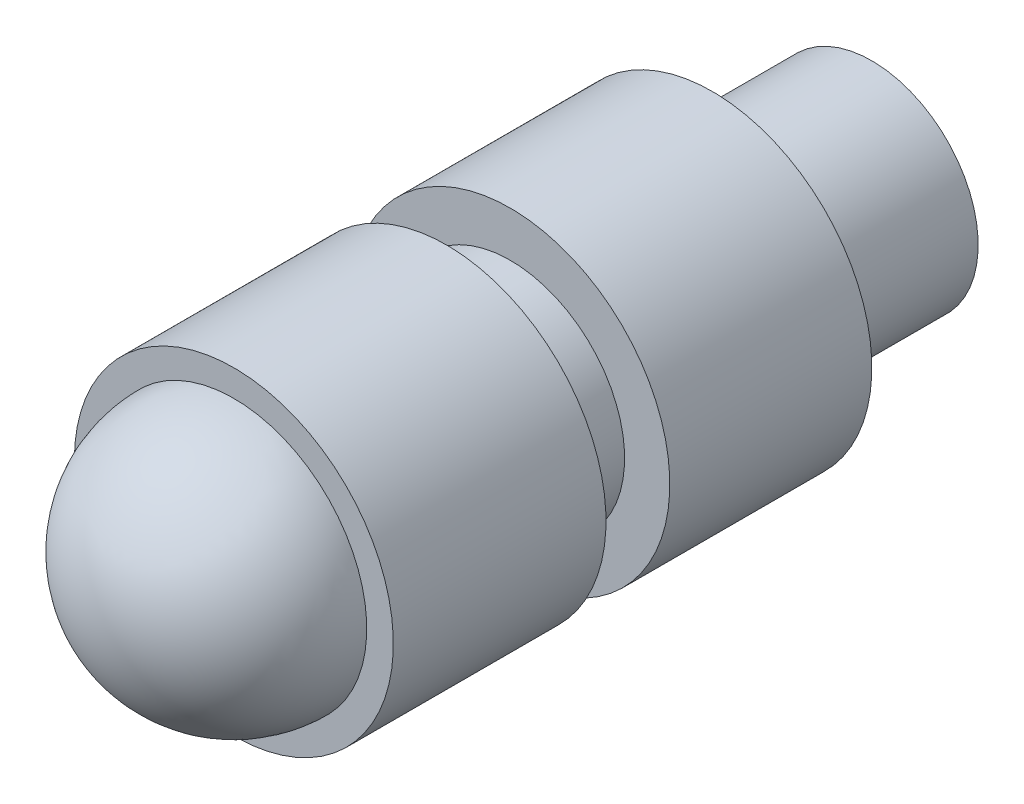
ISO-10303-21;
HEADER;
FILE_DESCRIPTION(('STEP AP214'),'2;1');
FILE_NAME('part.step','',(''),(''),'','','');
FILE_SCHEMA(('AUTOMOTIVE_DESIGN { 1 0 10303 214 1 1 1 1 }'));
ENDSEC;
DATA;
#1=APPLICATION_CONTEXT('core data for automotive mechanical design processes');
#2=APPLICATION_PROTOCOL_DEFINITION('international standard','automotive_design',2000,#1);
#3=PRODUCT_CONTEXT('',#1,'mechanical');
#4=PRODUCT('Part','Part','',(#3));
#5=PRODUCT_RELATED_PRODUCT_CATEGORY('part','',(#4));
#6=PRODUCT_DEFINITION_FORMATION('','',#4);
#7=PRODUCT_DEFINITION_CONTEXT('part definition',#1,'design');
#8=PRODUCT_DEFINITION('design','',#6,#7);
#9=PRODUCT_DEFINITION_SHAPE('','',#8);
#10=(LENGTH_UNIT() NAMED_UNIT(*) SI_UNIT(.MILLI.,.METRE.));
#11=(NAMED_UNIT(*) PLANE_ANGLE_UNIT() SI_UNIT($,.RADIAN.));
#12=(NAMED_UNIT(*) SI_UNIT($,.STERADIAN.) SOLID_ANGLE_UNIT());
#13=UNCERTAINTY_MEASURE_WITH_UNIT(LENGTH_MEASURE(1.E-05),#10,'distance_accuracy_value','');
#14=(GEOMETRIC_REPRESENTATION_CONTEXT(3) GLOBAL_UNCERTAINTY_ASSIGNED_CONTEXT((#13)) GLOBAL_UNIT_ASSIGNED_CONTEXT((#10,
#11,#12)) REPRESENTATION_CONTEXT('',''));
#15=CARTESIAN_POINT('',(0.,0.,0.));
#16=DIRECTION('',(0.,0.,1.));
#17=DIRECTION('',(1.,0.,0.));
#18=AXIS2_PLACEMENT_3D('',#15,#16,#17);
#19=CARTESIAN_POINT('',(0.000115765330758587,0.,-0.000115765330759021));
#20=DIRECTION('',(0.,-1.,0.));
#21=DIRECTION('',(-1.,0.,0.));
#22=AXIS2_PLACEMENT_3D('',#19,#20,#21);
#23=CIRCLE('',#22,5.00011576667089);
#24=TRIMMED_CURVE('',#23,(PARAMETER_VALUE(-1.5707731742648)),(PARAMETER_VALUE(1.5707731742648)),
.T.,.PARAMETER.);
#25=CARTESIAN_POINT('',(0.,0.,-0.000115765330759021));
#26=DIRECTION('',(0.,0.,-1.));
#27=AXIS1_PLACEMENT('',#25,#26);
#28=SURFACE_OF_REVOLUTION('',#24,#27);
#29=CARTESIAN_POINT('',(0.,0.,0.));
#30=DIRECTION('',(0.,0.,-1.));
#31=DIRECTION('',(-1.,0.,0.));
#32=AXIS2_PLACEMENT_3D('',#29,#30,#31);
#33=CIRCLE('',#32,5.);
#34=CARTESIAN_POINT('',(-5.,0.,0.));
#35=VERTEX_POINT('',#34);
#36=EDGE_CURVE('E11',#35,#35,#33,.T.);
#37=ORIENTED_EDGE('',*,*,#36,.F.);
#38=EDGE_LOOP('',(#37));
#39=FACE_BOUND('',#38,.T.);
#40=CARTESIAN_POINT('',(0.,0.,5.));
#41=VERTEX_POINT('',#40);
#42=VERTEX_LOOP('',#41);
#43=FACE_BOUND('',#42,.T.);
#44=ADVANCED_FACE('F41',(#39,#43),#28,.T.);
#45=CARTESIAN_POINT('',(5.,0.,0.));
#46=DIRECTION('',(0.,0.,-1.));
#47=DIRECTION('',(-1.,0.,0.));
#48=AXIS2_PLACEMENT_3D('',#45,#46,#47);
#49=PLANE('',#48);
#50=CARTESIAN_POINT('',(0.,0.,0.));
#51=DIRECTION('',(0.,0.,-1.));
#52=DIRECTION('',(-1.,0.,0.));
#53=AXIS2_PLACEMENT_3D('',#50,#51,#52);
#54=CIRCLE('',#53,6.);
#55=CARTESIAN_POINT('',(-6.,0.,0.));
#56=VERTEX_POINT('',#55);
#57=EDGE_CURVE('E47',#56,#56,#54,.T.);
#58=ORIENTED_EDGE('',*,*,#57,.F.);
#59=EDGE_LOOP('',(#58));
#60=FACE_BOUND('',#59,.T.);
#61=ORIENTED_EDGE('',*,*,#36,.T.);
#62=EDGE_LOOP('',(#61));
#63=FACE_BOUND('',#62,.T.);
#64=ADVANCED_FACE('F51',(#60,#63),#49,.F.);
#65=CARTESIAN_POINT('',(0.,0.,-30.));
#66=DIRECTION('',(0.,0.,-1.));
#67=DIRECTION('',(-1.,0.,0.));
#68=AXIS2_PLACEMENT_3D('',#65,#66,#67);
#69=CYLINDRICAL_SURFACE('',#68,6.);
#70=CARTESIAN_POINT('',(0.,0.,-8.));
#71=DIRECTION('',(0.,0.,-1.));
#72=DIRECTION('',(-1.,0.,0.));
#73=AXIS2_PLACEMENT_3D('',#70,#71,#72);
#74=CIRCLE('',#73,6.);
#75=CARTESIAN_POINT('',(-6.,0.,-8.));
#76=VERTEX_POINT('',#75);
#77=EDGE_CURVE('E116',#76,#76,#74,.T.);
#78=ORIENTED_EDGE('',*,*,#77,.F.);
#79=EDGE_LOOP('',(#78));
#80=FACE_BOUND('',#79,.T.);
#81=ORIENTED_EDGE('',*,*,#57,.T.);
#82=EDGE_LOOP('',(#81));
#83=FACE_BOUND('',#82,.T.);
#84=ADVANCED_FACE('F56',(#80,#83),#69,.T.);
#85=CARTESIAN_POINT('',(6.,0.,-8.));
#86=DIRECTION('',(0.,0.,1.));
#87=DIRECTION('',(1.,0.,0.));
#88=AXIS2_PLACEMENT_3D('',#85,#86,#87);
#89=PLANE('',#88);
#90=CARTESIAN_POINT('',(0.,0.,-8.));
#91=DIRECTION('',(0.,0.,-1.));
#92=DIRECTION('',(-1.,0.,0.));
#93=AXIS2_PLACEMENT_3D('',#90,#91,#92);
#94=CIRCLE('',#93,4.3);
#95=CARTESIAN_POINT('',(-4.3,0.,-8.));
#96=VERTEX_POINT('',#95);
#97=EDGE_CURVE('E113',#96,#96,#94,.T.);
#98=ORIENTED_EDGE('',*,*,#97,.F.);
#99=EDGE_LOOP('',(#98));
#100=FACE_BOUND('',#99,.T.);
#101=ORIENTED_EDGE('',*,*,#77,.T.);
#102=EDGE_LOOP('',(#101));
#103=FACE_BOUND('',#102,.T.);
#104=ADVANCED_FACE('F63',(#100,#103),#89,.F.);
#105=CARTESIAN_POINT('',(0.,0.,-30.));
#106=DIRECTION('',(0.,0.,-1.));
#107=DIRECTION('',(-1.,0.,0.));
#108=AXIS2_PLACEMENT_3D('',#105,#106,#107);
#109=CYLINDRICAL_SURFACE('',#108,4.3);
#110=CARTESIAN_POINT('',(0.,0.,-10.4));
#111=DIRECTION('',(0.,0.,-1.));
#112=DIRECTION('',(-1.,0.,0.));
#113=AXIS2_PLACEMENT_3D('',#110,#111,#112);
#114=CIRCLE('',#113,4.3);
#115=CARTESIAN_POINT('',(-4.3,0.,-10.4));
#116=VERTEX_POINT('',#115);
#117=EDGE_CURVE('E110',#116,#116,#114,.T.);
#118=ORIENTED_EDGE('',*,*,#117,.F.);
#119=EDGE_LOOP('',(#118));
#120=FACE_BOUND('',#119,.T.);
#121=ORIENTED_EDGE('',*,*,#97,.T.);
#122=EDGE_LOOP('',(#121));
#123=FACE_BOUND('',#122,.T.);
#124=ADVANCED_FACE('F70',(#120,#123),#109,.T.);
#125=CARTESIAN_POINT('',(4.3,0.,-10.4));
#126=DIRECTION('',(0.,0.,-1.));
#127=DIRECTION('',(-1.,0.,0.));
#128=AXIS2_PLACEMENT_3D('',#125,#126,#127);
#129=PLANE('',#128);
#130=CARTESIAN_POINT('',(0.,0.,-10.4));
#131=DIRECTION('',(0.,0.,-1.));
#132=DIRECTION('',(-1.,0.,0.));
#133=AXIS2_PLACEMENT_3D('',#130,#131,#132);
#134=CIRCLE('',#133,6.);
#135=CARTESIAN_POINT('',(-6.,0.,-10.4));
#136=VERTEX_POINT('',#135);
#137=EDGE_CURVE('E107',#136,#136,#134,.T.);
#138=ORIENTED_EDGE('',*,*,#137,.F.);
#139=EDGE_LOOP('',(#138));
#140=FACE_BOUND('',#139,.T.);
#141=ORIENTED_EDGE('',*,*,#117,.T.);
#142=EDGE_LOOP('',(#141));
#143=FACE_BOUND('',#142,.T.);
#144=ADVANCED_FACE('F74',(#140,#143),#129,.F.);
#145=CARTESIAN_POINT('',(0.,0.,-30.));
#146=DIRECTION('',(0.,0.,-1.));
#147=DIRECTION('',(-1.,0.,0.));
#148=AXIS2_PLACEMENT_3D('',#145,#146,#147);
#149=CYLINDRICAL_SURFACE('',#148,6.);
#150=CARTESIAN_POINT('',(0.,0.,-18.));
#151=DIRECTION('',(0.,0.,-1.));
#152=DIRECTION('',(-1.,0.,0.));
#153=AXIS2_PLACEMENT_3D('',#150,#151,#152);
#154=CIRCLE('',#153,6.);
#155=CARTESIAN_POINT('',(-6.,0.,-18.));
#156=VERTEX_POINT('',#155);
#157=EDGE_CURVE('E102',#156,#156,#154,.T.);
#158=ORIENTED_EDGE('',*,*,#157,.F.);
#159=EDGE_LOOP('',(#158));
#160=FACE_BOUND('',#159,.T.);
#161=ORIENTED_EDGE('',*,*,#137,.T.);
#162=EDGE_LOOP('',(#161));
#163=FACE_BOUND('',#162,.T.);
#164=ADVANCED_FACE('F78',(#160,#163),#149,.T.);
#165=CARTESIAN_POINT('',(6.,0.,-18.));
#166=DIRECTION('',(0.,0.,1.));
#167=DIRECTION('',(1.,0.,0.));
#168=AXIS2_PLACEMENT_3D('',#165,#166,#167);
#169=PLANE('',#168);
#170=CARTESIAN_POINT('',(0.,0.,-18.));
#171=DIRECTION('',(0.,0.,-1.));
#172=DIRECTION('',(-1.,0.,0.));
#173=AXIS2_PLACEMENT_3D('',#170,#171,#172);
#174=CIRCLE('',#173,4.);
#175=CARTESIAN_POINT('',(-4.,0.,-18.));
#176=VERTEX_POINT('',#175);
#177=EDGE_CURVE('E99',#176,#176,#174,.T.);
#178=ORIENTED_EDGE('',*,*,#177,.F.);
#179=EDGE_LOOP('',(#178));
#180=FACE_BOUND('',#179,.T.);
#181=ORIENTED_EDGE('',*,*,#157,.T.);
#182=EDGE_LOOP('',(#181));
#183=FACE_BOUND('',#182,.T.);
#184=ADVANCED_FACE('F82',(#180,#183),#169,.F.);
#185=CARTESIAN_POINT('',(0.,0.,-30.));
#186=DIRECTION('',(0.,0.,-1.));
#187=DIRECTION('',(-1.,0.,0.));
#188=AXIS2_PLACEMENT_3D('',#185,#186,#187);
#189=CYLINDRICAL_SURFACE('',#188,4.);
#190=CARTESIAN_POINT('',(0.,0.,-24.));
#191=DIRECTION('',(0.,0.,-1.));
#192=DIRECTION('',(-1.,0.,0.));
#193=AXIS2_PLACEMENT_3D('',#190,#191,#192);
#194=CIRCLE('',#193,4.);
#195=CARTESIAN_POINT('',(-4.,0.,-24.));
#196=VERTEX_POINT('',#195);
#197=EDGE_CURVE('E98',#196,#196,#194,.T.);
#198=ORIENTED_EDGE('',*,*,#197,.F.);
#199=EDGE_LOOP('',(#198));
#200=FACE_BOUND('',#199,.T.);
#201=ORIENTED_EDGE('',*,*,#177,.T.);
#202=EDGE_LOOP('',(#201));
#203=FACE_BOUND('',#202,.T.);
#204=ADVANCED_FACE('F86',(#200,#203),#189,.T.);
#205=CARTESIAN_POINT('',(4.,0.,-24.));
#206=DIRECTION('',(0.,0.,1.));
#207=DIRECTION('',(1.,0.,0.));
#208=AXIS2_PLACEMENT_3D('',#205,#206,#207);
#209=PLANE('',#208);
#210=ORIENTED_EDGE('',*,*,#197,.T.);
#211=EDGE_LOOP('',(#210));
#212=FACE_BOUND('',#211,.T.);
#213=ADVANCED_FACE('F90',(#212),#209,.F.);
#214=CLOSED_SHELL('',(#44,#64,#84,#104,#124,#144,#164,#184,#204,#213));
#215=MANIFOLD_SOLID_BREP('B2',#214);
#216=ADVANCED_BREP_SHAPE_REPRESENTATION('',(#18,#215),#14);
#217=SHAPE_DEFINITION_REPRESENTATION(#9,#216);
ENDSEC;
END-ISO-10303-21;
